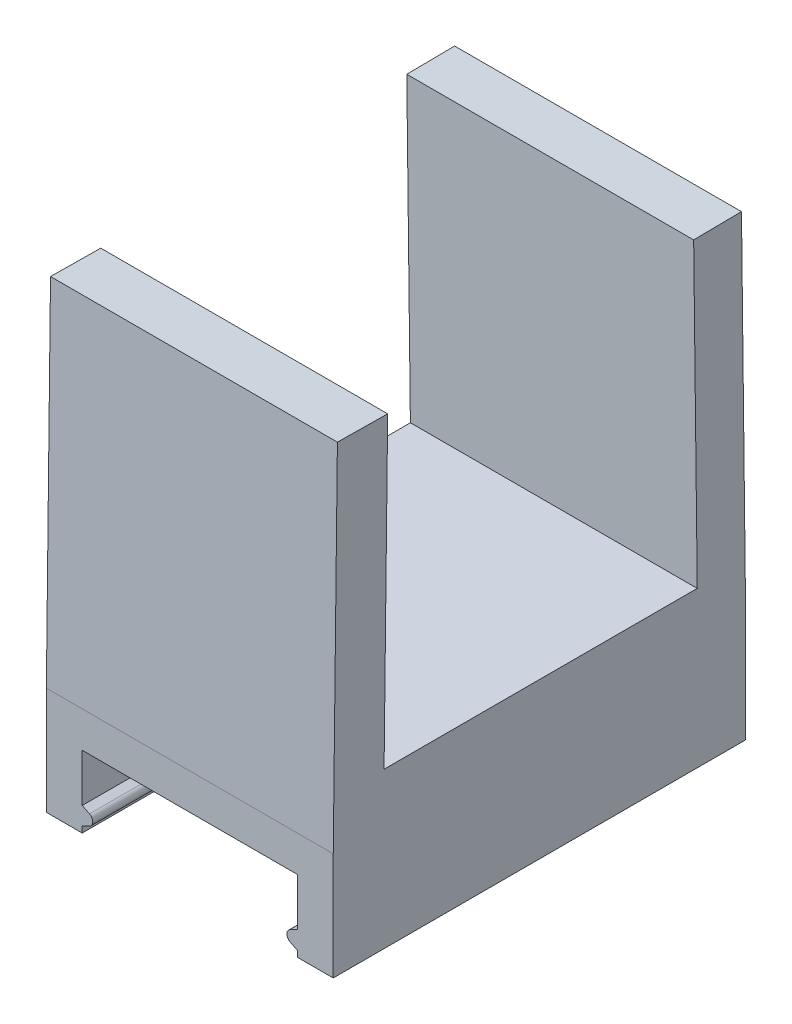
ISO-10303-21;
HEADER;
FILE_DESCRIPTION(('STEP AP214'),'2;1');
FILE_NAME('part.step','',(''),(''),'','','');
FILE_SCHEMA(('AUTOMOTIVE_DESIGN { 1 0 10303 214 1 1 1 1 }'));
ENDSEC;
DATA;
#1=APPLICATION_CONTEXT('core data for automotive mechanical design processes');
#2=APPLICATION_PROTOCOL_DEFINITION('international standard','automotive_design',2000,#1);
#3=PRODUCT_CONTEXT('',#1,'mechanical');
#4=PRODUCT('Part','Part','',(#3));
#5=PRODUCT_RELATED_PRODUCT_CATEGORY('part','',(#4));
#6=PRODUCT_DEFINITION_FORMATION('','',#4);
#7=PRODUCT_DEFINITION_CONTEXT('part definition',#1,'design');
#8=PRODUCT_DEFINITION('design','',#6,#7);
#9=PRODUCT_DEFINITION_SHAPE('','',#8);
#10=(LENGTH_UNIT() NAMED_UNIT(*) SI_UNIT(.MILLI.,.METRE.));
#11=(NAMED_UNIT(*) PLANE_ANGLE_UNIT() SI_UNIT($,.RADIAN.));
#12=(NAMED_UNIT(*) SI_UNIT($,.STERADIAN.) SOLID_ANGLE_UNIT());
#13=UNCERTAINTY_MEASURE_WITH_UNIT(LENGTH_MEASURE(1.E-05),#10,'distance_accuracy_value','');
#14=(GEOMETRIC_REPRESENTATION_CONTEXT(3) GLOBAL_UNCERTAINTY_ASSIGNED_CONTEXT((#13)) GLOBAL_UNIT_ASSIGNED_CONTEXT((#10,
#11,#12)) REPRESENTATION_CONTEXT('',''));
#15=CARTESIAN_POINT('',(0.,0.,0.));
#16=DIRECTION('',(0.,0.,1.));
#17=DIRECTION('',(1.,0.,0.));
#18=AXIS2_PLACEMENT_3D('',#15,#16,#17);
#19=CARTESIAN_POINT('',(9.,3.,34.5));
#20=DIRECTION('',(1.,0.,0.));
#21=DIRECTION('',(0.,1.,0.));
#22=AXIS2_PLACEMENT_3D('',#19,#20,#21);
#23=PLANE('',#22);
#24=DIRECTION('',(0.,-1.,0.));
#25=VECTOR('',#24,1.);
#26=CARTESIAN_POINT('',(9.,3.,0.));
#27=LINE('',#26,#25);
#28=CARTESIAN_POINT('',(9.,3.,0.));
#29=VERTEX_POINT('',#28);
#30=CARTESIAN_POINT('',(8.99999999999999,-1.,0.));
#31=VERTEX_POINT('',#30);
#32=EDGE_CURVE('E177',#29,#31,#27,.T.);
#33=ORIENTED_EDGE('',*,*,#32,.T.);
#34=DIRECTION('',(0.,0.,-1.));
#35=VECTOR('',#34,1.);
#36=CARTESIAN_POINT('',(8.99999999999999,-1.,34.5));
#37=LINE('',#36,#35);
#38=CARTESIAN_POINT('',(8.99999999999999,-1.,34.5));
#39=VERTEX_POINT('',#38);
#40=EDGE_CURVE('E11',#39,#31,#37,.T.);
#41=ORIENTED_EDGE('',*,*,#40,.F.);
#42=DIRECTION('',(0.,-1.,0.));
#43=VECTOR('',#42,1.);
#44=CARTESIAN_POINT('',(9.,3.,34.5));
#45=LINE('',#44,#43);
#46=CARTESIAN_POINT('',(9.,3.,34.5));
#47=VERTEX_POINT('',#46);
#48=EDGE_CURVE('E210',#47,#39,#45,.T.);
#49=ORIENTED_EDGE('',*,*,#48,.F.);
#50=DIRECTION('',(0.,0.,-1.));
#51=VECTOR('',#50,1.);
#52=CARTESIAN_POINT('',(9.,3.,34.5));
#53=LINE('',#52,#51);
#54=EDGE_CURVE('E173',#47,#29,#53,.T.);
#55=ORIENTED_EDGE('',*,*,#54,.T.);
#56=EDGE_LOOP('',(#33,#41,#49,#55));
#57=FACE_BOUND('',#56,.T.);
#58=ADVANCED_FACE('F33',(#57),#23,.F.);
#59=CARTESIAN_POINT('',(8.99999999999999,-1.,34.5));
#60=DIRECTION('',(0.447213595499958,-0.894427190999916,0.));
#61=DIRECTION('',(0.894427190999916,0.447213595499959,0.));
#62=AXIS2_PLACEMENT_3D('',#59,#60,#61);
#63=PLANE('',#62);
#64=DIRECTION('',(-0.894427190999916,-0.447213595499958,0.));
#65=VECTOR('',#64,1.);
#66=CARTESIAN_POINT('',(8.99999999999999,-1.,0.));
#67=LINE('',#66,#65);
#68=CARTESIAN_POINT('',(8.39442719099992,-1.30278640450004,0.));
#69=VERTEX_POINT('',#68);
#70=EDGE_CURVE('E180',#31,#69,#67,.T.);
#71=ORIENTED_EDGE('',*,*,#70,.T.);
#72=DIRECTION('',(0.,0.,-1.));
#73=VECTOR('',#72,1.);
#74=CARTESIAN_POINT('',(8.39442719099992,-1.30278640450004,34.5));
#75=LINE('',#74,#73);
#76=CARTESIAN_POINT('',(8.39442719099992,-1.30278640450004,34.5));
#77=VERTEX_POINT('',#76);
#78=EDGE_CURVE('E41',#77,#69,#75,.T.);
#79=ORIENTED_EDGE('',*,*,#78,.F.);
#80=DIRECTION('',(-0.894427190999916,-0.447213595499958,0.));
#81=VECTOR('',#80,1.);
#82=CARTESIAN_POINT('',(8.99999999999999,-1.,34.5));
#83=LINE('',#82,#81);
#84=EDGE_CURVE('E114',#39,#77,#83,.T.);
#85=ORIENTED_EDGE('',*,*,#84,.F.);
#86=ORIENTED_EDGE('',*,*,#40,.T.);
#87=EDGE_LOOP('',(#71,#79,#85,#86));
#88=FACE_BOUND('',#87,.T.);
#89=ADVANCED_FACE('F302',(#88),#63,.F.);
#90=CARTESIAN_POINT('',(8.61803398874989,-1.75,34.5));
#91=DIRECTION('',(0.,0.,-1.));
#92=DIRECTION('',(-1.,0.,0.));
#93=AXIS2_PLACEMENT_3D('',#90,#91,#92);
#94=CYLINDRICAL_SURFACE('',#93,0.499999999999999);
#95=CARTESIAN_POINT('',(8.61803398874989,-1.75,0.));
#96=DIRECTION('',(0.,0.,1.));
#97=DIRECTION('',(1.,0.,0.));
#98=AXIS2_PLACEMENT_3D('',#95,#96,#97);
#99=CIRCLE('',#98,0.499999999999999);
#100=CARTESIAN_POINT('',(8.39442719099992,-2.19721359549996,0.));
#101=VERTEX_POINT('',#100);
#102=EDGE_CURVE('E183',#69,#101,#99,.T.);
#103=ORIENTED_EDGE('',*,*,#102,.T.);
#104=DIRECTION('',(0.,0.,-1.));
#105=VECTOR('',#104,1.);
#106=CARTESIAN_POINT('',(8.39442719099992,-2.19721359549996,34.5));
#107=LINE('',#106,#105);
#108=CARTESIAN_POINT('',(8.39442719099992,-2.19721359549996,34.5));
#109=VERTEX_POINT('',#108);
#110=EDGE_CURVE('E235',#109,#101,#107,.T.);
#111=ORIENTED_EDGE('',*,*,#110,.F.);
#112=CARTESIAN_POINT('',(8.61803398874989,-1.75,34.5));
#113=DIRECTION('',(0.,0.,1.));
#114=DIRECTION('',(1.,0.,0.));
#115=AXIS2_PLACEMENT_3D('',#112,#113,#114);
#116=CIRCLE('',#115,0.499999999999999);
#117=EDGE_CURVE('E243',#77,#109,#116,.T.);
#118=ORIENTED_EDGE('',*,*,#117,.F.);
#119=ORIENTED_EDGE('',*,*,#78,.T.);
#120=EDGE_LOOP('',(#103,#111,#118,#119));
#121=FACE_BOUND('',#120,.T.);
#122=ADVANCED_FACE('F241',(#121),#94,.T.);
#123=CARTESIAN_POINT('',(9.,-2.5,34.5));
#124=DIRECTION('',(0.447213595499955,0.894427190999917,0.));
#125=DIRECTION('',(-0.894427190999917,0.447213595499955,0.));
#126=AXIS2_PLACEMENT_3D('',#123,#124,#125);
#127=PLANE('',#126);
#128=DIRECTION('',(0.894427190999917,-0.447213595499955,0.));
#129=VECTOR('',#128,1.);
#130=CARTESIAN_POINT('',(9.,-2.5,0.));
#131=LINE('',#130,#129);
#132=CARTESIAN_POINT('',(9.,-2.5,0.));
#133=VERTEX_POINT('',#132);
#134=EDGE_CURVE('E185',#101,#133,#131,.T.);
#135=ORIENTED_EDGE('',*,*,#134,.T.);
#136=DIRECTION('',(0.,0.,-1.));
#137=VECTOR('',#136,1.);
#138=CARTESIAN_POINT('',(9.,-2.5,34.5));
#139=LINE('',#138,#137);
#140=CARTESIAN_POINT('',(9.,-2.5,34.5));
#141=VERTEX_POINT('',#140);
#142=EDGE_CURVE('E232',#141,#133,#139,.T.);
#143=ORIENTED_EDGE('',*,*,#142,.F.);
#144=DIRECTION('',(0.894427190999917,-0.447213595499955,0.));
#145=VECTOR('',#144,1.);
#146=CARTESIAN_POINT('',(9.,-2.5,34.5));
#147=LINE('',#146,#145);
#148=EDGE_CURVE('E261',#109,#141,#147,.T.);
#149=ORIENTED_EDGE('',*,*,#148,.F.);
#150=ORIENTED_EDGE('',*,*,#110,.T.);
#151=EDGE_LOOP('',(#135,#143,#149,#150));
#152=FACE_BOUND('',#151,.T.);
#153=ADVANCED_FACE('F252',(#152),#127,.F.);
#154=CARTESIAN_POINT('',(9.,-2.5,34.5));
#155=DIRECTION('',(1.,0.,0.));
#156=DIRECTION('',(0.,1.,0.));
#157=AXIS2_PLACEMENT_3D('',#154,#155,#156);
#158=PLANE('',#157);
#159=DIRECTION('',(0.,-1.,0.));
#160=VECTOR('',#159,1.);
#161=CARTESIAN_POINT('',(9.,-2.5,0.));
#162=LINE('',#161,#160);
#163=CARTESIAN_POINT('',(8.99999999999999,-3.,0.));
#164=VERTEX_POINT('',#163);
#165=EDGE_CURVE('E187',#133,#164,#162,.T.);
#166=ORIENTED_EDGE('',*,*,#165,.T.);
#167=DIRECTION('',(0.,0.,-1.));
#168=VECTOR('',#167,1.);
#169=CARTESIAN_POINT('',(8.99999999999999,-3.,34.5));
#170=LINE('',#169,#168);
#171=CARTESIAN_POINT('',(8.99999999999999,-3.,34.5));
#172=VERTEX_POINT('',#171);
#173=EDGE_CURVE('E229',#172,#164,#170,.T.);
#174=ORIENTED_EDGE('',*,*,#173,.F.);
#175=DIRECTION('',(0.,-1.,0.));
#176=VECTOR('',#175,1.);
#177=CARTESIAN_POINT('',(9.,-2.5,34.5));
#178=LINE('',#177,#176);
#179=EDGE_CURVE('E258',#141,#172,#178,.T.);
#180=ORIENTED_EDGE('',*,*,#179,.F.);
#181=ORIENTED_EDGE('',*,*,#142,.T.);
#182=EDGE_LOOP('',(#166,#174,#180,#181));
#183=FACE_BOUND('',#182,.T.);
#184=ADVANCED_FACE('F256',(#183),#158,.F.);
#185=CARTESIAN_POINT('',(12.,-3.,34.5));
#186=DIRECTION('',(0.,1.,0.));
#187=DIRECTION('',(-1.,0.,0.));
#188=AXIS2_PLACEMENT_3D('',#185,#186,#187);
#189=PLANE('',#188);
#190=DIRECTION('',(1.,0.,0.));
#191=VECTOR('',#190,1.);
#192=CARTESIAN_POINT('',(12.,-3.,0.));
#193=LINE('',#192,#191);
#194=CARTESIAN_POINT('',(12.,-3.,0.));
#195=VERTEX_POINT('',#194);
#196=EDGE_CURVE('E189',#164,#195,#193,.T.);
#197=ORIENTED_EDGE('',*,*,#196,.T.);
#198=DIRECTION('',(0.,0.,-1.));
#199=VECTOR('',#198,1.);
#200=CARTESIAN_POINT('',(12.,-3.,34.5));
#201=LINE('',#200,#199);
#202=CARTESIAN_POINT('',(12.,-3.,34.5));
#203=VERTEX_POINT('',#202);
#204=EDGE_CURVE('E226',#203,#195,#201,.T.);
#205=ORIENTED_EDGE('',*,*,#204,.F.);
#206=DIRECTION('',(1.,0.,0.));
#207=VECTOR('',#206,1.);
#208=CARTESIAN_POINT('',(12.,-3.,34.5));
#209=LINE('',#208,#207);
#210=EDGE_CURVE('E260',#172,#203,#209,.T.);
#211=ORIENTED_EDGE('',*,*,#210,.F.);
#212=ORIENTED_EDGE('',*,*,#173,.T.);
#213=EDGE_LOOP('',(#197,#205,#211,#212));
#214=FACE_BOUND('',#213,.T.);
#215=ADVANCED_FACE('F315',(#214),#189,.F.);
#216=CARTESIAN_POINT('',(12.,6.,34.5));
#217=DIRECTION('',(-1.,0.,0.));
#218=DIRECTION('',(0.,0.,1.));
#219=AXIS2_PLACEMENT_3D('',#216,#217,#218);
#220=PLANE('',#219);
#221=DIRECTION('',(0.,1.,0.));
#222=VECTOR('',#221,1.);
#223=CARTESIAN_POINT('',(12.,6.,0.));
#224=LINE('',#223,#222);
#225=CARTESIAN_POINT('',(12.,6.,0.));
#226=VERTEX_POINT('',#225);
#227=EDGE_CURVE('E191',#195,#226,#224,.T.);
#228=ORIENTED_EDGE('',*,*,#227,.T.);
#229=DIRECTION('',(0.,0.999930257157274,0.0118101998876774));
#230=VECTOR('',#229,1.);
#231=CARTESIAN_POINT('',(12.,6.,0.));
#232=LINE('',#231,#230);
#233=CARTESIAN_POINT('',(12.,35.4472407995507,0.347802056687385));
#234=VERTEX_POINT('',#233);
#235=EDGE_CURVE('E516',#226,#234,#232,.T.);
#236=ORIENTED_EDGE('',*,*,#235,.T.);
#237=DIRECTION('',(0.,-0.0118101998876786,0.999930257157275));
#238=VECTOR('',#237,1.);
#239=CARTESIAN_POINT('',(12.,35.4,4.34752308531648));
#240=LINE('',#239,#238);
#241=CARTESIAN_POINT('',(12.,35.4,4.34752308531648));
#242=VERTEX_POINT('',#241);
#243=EDGE_CURVE('E519',#234,#242,#240,.T.);
#244=ORIENTED_EDGE('',*,*,#243,.T.);
#245=DIRECTION('',(0.,-0.999930257157274,-0.0118101998876776));
#246=VECTOR('',#245,1.);
#247=CARTESIAN_POINT('',(12.,10.,4.04752308531665));
#248=LINE('',#247,#246);
#249=CARTESIAN_POINT('',(12.,10.,4.04752308531665));
#250=VERTEX_POINT('',#249);
#251=EDGE_CURVE('E522',#242,#250,#248,.T.);
#252=ORIENTED_EDGE('',*,*,#251,.T.);
#253=DIRECTION('',(0.,0.,1.));
#254=VECTOR('',#253,1.);
#255=CARTESIAN_POINT('',(12.,10.,30.2475230853167));
#256=LINE('',#255,#254);
#257=CARTESIAN_POINT('',(12.,10.,30.2475230853167));
#258=VERTEX_POINT('',#257);
#259=EDGE_CURVE('E493',#250,#258,#256,.T.);
#260=ORIENTED_EDGE('',*,*,#259,.T.);
#261=DIRECTION('',(0.,0.99993134252064,-0.0117179454201705));
#262=VECTOR('',#261,1.);
#263=CARTESIAN_POINT('',(12.,35.6,29.9475230853165));
#264=LINE('',#263,#262);
#265=CARTESIAN_POINT('',(12.,35.6,29.9475230853165));
#266=VERTEX_POINT('',#265);
#267=EDGE_CURVE('E181',#258,#266,#264,.T.);
#268=ORIENTED_EDGE('',*,*,#267,.T.);
#269=DIRECTION('',(0.,0.0117179454201706,0.99993134252064));
#270=VECTOR('',#269,1.);
#271=CARTESIAN_POINT('',(12.,35.6492776301851,34.1525475277711));
#272=LINE('',#271,#270);
#273=CARTESIAN_POINT('',(12.,35.6492776301851,34.1525475277711));
#274=VERTEX_POINT('',#273);
#275=EDGE_CURVE('E471',#266,#274,#272,.T.);
#276=ORIENTED_EDGE('',*,*,#275,.T.);
#277=DIRECTION('',(0.,-0.99993134252064,0.0117179454201708));
#278=VECTOR('',#277,1.);
#279=CARTESIAN_POINT('',(12.,35.6492776301851,34.1525475277711));
#280=LINE('',#279,#278);
#281=CARTESIAN_POINT('',(12.,6.,34.5));
#282=VERTEX_POINT('',#281);
#283=EDGE_CURVE('E473',#274,#282,#280,.T.);
#284=ORIENTED_EDGE('',*,*,#283,.T.);
#285=DIRECTION('',(0.,1.,0.));
#286=VECTOR('',#285,1.);
#287=CARTESIAN_POINT('',(12.,6.,34.5));
#288=LINE('',#287,#286);
#289=EDGE_CURVE('E263',#203,#282,#288,.T.);
#290=ORIENTED_EDGE('',*,*,#289,.F.);
#291=ORIENTED_EDGE('',*,*,#204,.T.);
#292=EDGE_LOOP('',(#228,#236,#244,#252,#260,#268,#276,#284,#290,#291));
#293=FACE_BOUND('',#292,.T.);
#294=ADVANCED_FACE('F318',(#293),#220,.F.);
#295=CARTESIAN_POINT('',(-12.,-3.,34.5));
#296=DIRECTION('',(1.,0.,0.));
#297=DIRECTION('',(0.,0.,-1.));
#298=AXIS2_PLACEMENT_3D('',#295,#296,#297);
#299=PLANE('',#298);
#300=DIRECTION('',(0.,-1.,0.));
#301=VECTOR('',#300,1.);
#302=CARTESIAN_POINT('',(-12.,-3.,0.));
#303=LINE('',#302,#301);
#304=CARTESIAN_POINT('',(-12.,6.,0.));
#305=VERTEX_POINT('',#304);
#306=CARTESIAN_POINT('',(-12.,-3.,0.));
#307=VERTEX_POINT('',#306);
#308=EDGE_CURVE('E197',#305,#307,#303,.T.);
#309=ORIENTED_EDGE('',*,*,#308,.T.);
#310=DIRECTION('',(0.,0.,-1.));
#311=VECTOR('',#310,1.);
#312=CARTESIAN_POINT('',(-12.,-3.,34.5));
#313=LINE('',#312,#311);
#314=CARTESIAN_POINT('',(-12.,-3.,34.5));
#315=VERTEX_POINT('',#314);
#316=EDGE_CURVE('E223',#315,#307,#313,.T.);
#317=ORIENTED_EDGE('',*,*,#316,.F.);
#318=DIRECTION('',(0.,-1.,0.));
#319=VECTOR('',#318,1.);
#320=CARTESIAN_POINT('',(-12.,-3.,34.5));
#321=LINE('',#320,#319);
#322=CARTESIAN_POINT('',(-12.,6.,34.5));
#323=VERTEX_POINT('',#322);
#324=EDGE_CURVE('E271',#323,#315,#321,.T.);
#325=ORIENTED_EDGE('',*,*,#324,.F.);
#326=DIRECTION('',(0.,0.99993134252064,-0.0117179454201708));
#327=VECTOR('',#326,1.);
#328=CARTESIAN_POINT('',(-12.,35.6492776301851,34.1525475277711));
#329=LINE('',#328,#327);
#330=CARTESIAN_POINT('',(-12.,35.6492776301851,34.1525475277711));
#331=VERTEX_POINT('',#330);
#332=EDGE_CURVE('E479',#323,#331,#329,.T.);
#333=ORIENTED_EDGE('',*,*,#332,.T.);
#334=DIRECTION('',(0.,-0.0117179454201706,-0.99993134252064));
#335=VECTOR('',#334,1.);
#336=CARTESIAN_POINT('',(-12.,35.6492776301851,34.1525475277711));
#337=LINE('',#336,#335);
#338=CARTESIAN_POINT('',(-12.,35.6,29.9475230853165));
#339=VERTEX_POINT('',#338);
#340=EDGE_CURVE('E511',#331,#339,#337,.T.);
#341=ORIENTED_EDGE('',*,*,#340,.T.);
#342=DIRECTION('',(0.,-0.99993134252064,0.0117179454201705));
#343=VECTOR('',#342,1.);
#344=CARTESIAN_POINT('',(-12.,35.6,29.9475230853165));
#345=LINE('',#344,#343);
#346=CARTESIAN_POINT('',(-12.,10.,30.2475230853167));
#347=VERTEX_POINT('',#346);
#348=EDGE_CURVE('E508',#339,#347,#345,.T.);
#349=ORIENTED_EDGE('',*,*,#348,.T.);
#350=DIRECTION('',(0.,0.,-1.));
#351=VECTOR('',#350,1.);
#352=CARTESIAN_POINT('',(-12.,10.,30.2475230853167));
#353=LINE('',#352,#351);
#354=CARTESIAN_POINT('',(-12.,10.,4.04752308531665));
#355=VERTEX_POINT('',#354);
#356=EDGE_CURVE('E505',#347,#355,#353,.T.);
#357=ORIENTED_EDGE('',*,*,#356,.T.);
#358=DIRECTION('',(0.,0.999930257157275,0.0118101998876776));
#359=VECTOR('',#358,1.);
#360=CARTESIAN_POINT('',(-12.,10.,4.04752308531665));
#361=LINE('',#360,#359);
#362=CARTESIAN_POINT('',(-12.,35.4,4.34752308531648));
#363=VERTEX_POINT('',#362);
#364=EDGE_CURVE('E502',#355,#363,#361,.T.);
#365=ORIENTED_EDGE('',*,*,#364,.T.);
#366=DIRECTION('',(0.,0.0118101998876786,-0.999930257157274));
#367=VECTOR('',#366,1.);
#368=CARTESIAN_POINT('',(-12.,35.4,4.34752308531648));
#369=LINE('',#368,#367);
#370=CARTESIAN_POINT('',(-12.,35.4472407995507,0.347802056687385));
#371=VERTEX_POINT('',#370);
#372=EDGE_CURVE('E499',#363,#371,#369,.T.);
#373=ORIENTED_EDGE('',*,*,#372,.T.);
#374=DIRECTION('',(0.,-0.999930257157274,-0.0118101998876774));
#375=VECTOR('',#374,1.);
#376=CARTESIAN_POINT('',(-12.,6.,0.));
#377=LINE('',#376,#375);
#378=EDGE_CURVE('E496',#371,#305,#377,.T.);
#379=ORIENTED_EDGE('',*,*,#378,.T.);
#380=EDGE_LOOP('',(#309,#317,#325,#333,#341,#349,#357,#365,#373,#379));
#381=FACE_BOUND('',#380,.T.);
#382=ADVANCED_FACE('F322',(#381),#299,.F.);
#383=CARTESIAN_POINT('',(-9.,-3.,34.5));
#384=DIRECTION('',(0.,1.,0.));
#385=DIRECTION('',(0.,0.,1.));
#386=AXIS2_PLACEMENT_3D('',#383,#384,#385);
#387=PLANE('',#386);
#388=DIRECTION('',(1.,0.,0.));
#389=VECTOR('',#388,1.);
#390=CARTESIAN_POINT('',(-9.,-3.,0.));
#391=LINE('',#390,#389);
#392=CARTESIAN_POINT('',(-9.,-3.,0.));
#393=VERTEX_POINT('',#392);
#394=EDGE_CURVE('E199',#307,#393,#391,.T.);
#395=ORIENTED_EDGE('',*,*,#394,.T.);
#396=DIRECTION('',(0.,0.,-1.));
#397=VECTOR('',#396,1.);
#398=CARTESIAN_POINT('',(-9.,-3.,34.5));
#399=LINE('',#398,#397);
#400=CARTESIAN_POINT('',(-9.,-3.,34.5));
#401=VERTEX_POINT('',#400);
#402=EDGE_CURVE('E220',#401,#393,#399,.T.);
#403=ORIENTED_EDGE('',*,*,#402,.F.);
#404=DIRECTION('',(1.,0.,0.));
#405=VECTOR('',#404,1.);
#406=CARTESIAN_POINT('',(-9.,-3.,34.5));
#407=LINE('',#406,#405);
#408=EDGE_CURVE('E273',#315,#401,#407,.T.);
#409=ORIENTED_EDGE('',*,*,#408,.F.);
#410=ORIENTED_EDGE('',*,*,#316,.T.);
#411=EDGE_LOOP('',(#395,#403,#409,#410));
#412=FACE_BOUND('',#411,.T.);
#413=ADVANCED_FACE('F326',(#412),#387,.F.);
#414=CARTESIAN_POINT('',(-9.,-2.5,34.5));
#415=DIRECTION('',(-1.,0.,0.));
#416=DIRECTION('',(0.,0.,1.));
#417=AXIS2_PLACEMENT_3D('',#414,#415,#416);
#418=PLANE('',#417);
#419=DIRECTION('',(0.,1.,0.));
#420=VECTOR('',#419,1.);
#421=CARTESIAN_POINT('',(-9.,-2.5,0.));
#422=LINE('',#421,#420);
#423=CARTESIAN_POINT('',(-9.,-2.5,0.));
#424=VERTEX_POINT('',#423);
#425=EDGE_CURVE('E201',#393,#424,#422,.T.);
#426=ORIENTED_EDGE('',*,*,#425,.T.);
#427=DIRECTION('',(0.,0.,-1.));
#428=VECTOR('',#427,1.);
#429=CARTESIAN_POINT('',(-9.,-2.5,34.5));
#430=LINE('',#429,#428);
#431=CARTESIAN_POINT('',(-9.,-2.5,34.5));
#432=VERTEX_POINT('',#431);
#433=EDGE_CURVE('E217',#432,#424,#430,.T.);
#434=ORIENTED_EDGE('',*,*,#433,.F.);
#435=DIRECTION('',(0.,1.,0.));
#436=VECTOR('',#435,1.);
#437=CARTESIAN_POINT('',(-9.,-2.5,34.5));
#438=LINE('',#437,#436);
#439=EDGE_CURVE('E275',#401,#432,#438,.T.);
#440=ORIENTED_EDGE('',*,*,#439,.F.);
#441=ORIENTED_EDGE('',*,*,#402,.T.);
#442=EDGE_LOOP('',(#426,#434,#440,#441));
#443=FACE_BOUND('',#442,.T.);
#444=ADVANCED_FACE('F330',(#443),#418,.F.);
#445=CARTESIAN_POINT('',(-9.,-2.5,34.5));
#446=DIRECTION('',(-0.447213595499958,0.894427190999916,0.));
#447=DIRECTION('',(-0.894427190999916,-0.447213595499959,0.));
#448=AXIS2_PLACEMENT_3D('',#445,#446,#447);
#449=PLANE('',#448);
#450=DIRECTION('',(0.894427190999916,0.447213595499958,0.));
#451=VECTOR('',#450,1.);
#452=CARTESIAN_POINT('',(-9.,-2.5,0.));
#453=LINE('',#452,#451);
#454=CARTESIAN_POINT('',(-8.39442719099992,-2.19721359549996,0.));
#455=VERTEX_POINT('',#454);
#456=EDGE_CURVE('E203',#424,#455,#453,.T.);
#457=ORIENTED_EDGE('',*,*,#456,.T.);
#458=DIRECTION('',(0.,0.,-1.));
#459=VECTOR('',#458,1.);
#460=CARTESIAN_POINT('',(-8.39442719099992,-2.19721359549996,34.5));
#461=LINE('',#460,#459);
#462=CARTESIAN_POINT('',(-8.39442719099992,-2.19721359549996,34.5));
#463=VERTEX_POINT('',#462);
#464=EDGE_CURVE('E214',#463,#455,#461,.T.);
#465=ORIENTED_EDGE('',*,*,#464,.F.);
#466=DIRECTION('',(0.894427190999916,0.447213595499958,0.));
#467=VECTOR('',#466,1.);
#468=CARTESIAN_POINT('',(-9.,-2.5,34.5));
#469=LINE('',#468,#467);
#470=EDGE_CURVE('E277',#432,#463,#469,.T.);
#471=ORIENTED_EDGE('',*,*,#470,.F.);
#472=ORIENTED_EDGE('',*,*,#433,.T.);
#473=EDGE_LOOP('',(#457,#465,#471,#472));
#474=FACE_BOUND('',#473,.T.);
#475=ADVANCED_FACE('F283',(#474),#449,.F.);
#476=CARTESIAN_POINT('',(-8.61803398874989,-1.75,34.5));
#477=DIRECTION('',(0.,0.,-1.));
#478=DIRECTION('',(-1.,0.,0.));
#479=AXIS2_PLACEMENT_3D('',#476,#477,#478);
#480=CYLINDRICAL_SURFACE('',#479,0.499999999999999);
#481=CARTESIAN_POINT('',(-8.61803398874989,-1.75,0.));
#482=DIRECTION('',(0.,0.,1.));
#483=DIRECTION('',(-1.,0.,0.));
#484=AXIS2_PLACEMENT_3D('',#481,#482,#483);
#485=CIRCLE('',#484,0.499999999999999);
#486=CARTESIAN_POINT('',(-8.39442719099992,-1.30278640450004,0.));
#487=VERTEX_POINT('',#486);
#488=EDGE_CURVE('E205',#455,#487,#485,.T.);
#489=ORIENTED_EDGE('',*,*,#488,.T.);
#490=DIRECTION('',(0.,0.,-1.));
#491=VECTOR('',#490,1.);
#492=CARTESIAN_POINT('',(-8.39442719099992,-1.30278640450004,34.5));
#493=LINE('',#492,#491);
#494=CARTESIAN_POINT('',(-8.39442719099992,-1.30278640450004,34.5));
#495=VERTEX_POINT('',#494);
#496=EDGE_CURVE('E168',#495,#487,#493,.T.);
#497=ORIENTED_EDGE('',*,*,#496,.F.);
#498=CARTESIAN_POINT('',(-8.61803398874989,-1.75,34.5));
#499=DIRECTION('',(0.,0.,1.));
#500=DIRECTION('',(-1.,0.,0.));
#501=AXIS2_PLACEMENT_3D('',#498,#499,#500);
#502=CIRCLE('',#501,0.499999999999999);
#503=EDGE_CURVE('E159',#463,#495,#502,.T.);
#504=ORIENTED_EDGE('',*,*,#503,.F.);
#505=ORIENTED_EDGE('',*,*,#464,.T.);
#506=EDGE_LOOP('',(#489,#497,#504,#505));
#507=FACE_BOUND('',#506,.T.);
#508=ADVANCED_FACE('F287',(#507),#480,.T.);
#509=CARTESIAN_POINT('',(-9.,-1.,34.5));
#510=DIRECTION('',(-0.447213595499958,-0.894427190999916,0.));
#511=DIRECTION('',(0.894427190999916,-0.447213595499959,0.));
#512=AXIS2_PLACEMENT_3D('',#509,#510,#511);
#513=PLANE('',#512);
#514=DIRECTION('',(-0.894427190999916,0.447213595499958,0.));
#515=VECTOR('',#514,1.);
#516=CARTESIAN_POINT('',(-9.,-1.,0.));
#517=LINE('',#516,#515);
#518=CARTESIAN_POINT('',(-9.,-1.,0.));
#519=VERTEX_POINT('',#518);
#520=EDGE_CURVE('E167',#487,#519,#517,.T.);
#521=ORIENTED_EDGE('',*,*,#520,.T.);
#522=DIRECTION('',(0.,0.,-1.));
#523=VECTOR('',#522,1.);
#524=CARTESIAN_POINT('',(-9.,-1.,34.5));
#525=LINE('',#524,#523);
#526=CARTESIAN_POINT('',(-9.,-1.,34.5));
#527=VERTEX_POINT('',#526);
#528=EDGE_CURVE('E164',#527,#519,#525,.T.);
#529=ORIENTED_EDGE('',*,*,#528,.F.);
#530=DIRECTION('',(-0.894427190999916,0.447213595499958,0.));
#531=VECTOR('',#530,1.);
#532=CARTESIAN_POINT('',(-9.,-1.,34.5));
#533=LINE('',#532,#531);
#534=EDGE_CURVE('E153',#495,#527,#533,.T.);
#535=ORIENTED_EDGE('',*,*,#534,.F.);
#536=ORIENTED_EDGE('',*,*,#496,.T.);
#537=EDGE_LOOP('',(#521,#529,#535,#536));
#538=FACE_BOUND('',#537,.T.);
#539=ADVANCED_FACE('F165',(#538),#513,.F.);
#540=CARTESIAN_POINT('',(-9.,3.,34.5));
#541=DIRECTION('',(-1.,0.,0.));
#542=DIRECTION('',(0.,-1.,0.));
#543=AXIS2_PLACEMENT_3D('',#540,#541,#542);
#544=PLANE('',#543);
#545=DIRECTION('',(0.,1.,0.));
#546=VECTOR('',#545,1.);
#547=CARTESIAN_POINT('',(-9.,3.,0.));
#548=LINE('',#547,#546);
#549=CARTESIAN_POINT('',(-9.,3.,0.));
#550=VERTEX_POINT('',#549);
#551=EDGE_CURVE('E100',#519,#550,#548,.T.);
#552=ORIENTED_EDGE('',*,*,#551,.T.);
#553=DIRECTION('',(0.,0.,-1.));
#554=VECTOR('',#553,1.);
#555=CARTESIAN_POINT('',(-9.,3.,34.5));
#556=LINE('',#555,#554);
#557=CARTESIAN_POINT('',(-9.,3.,34.5));
#558=VERTEX_POINT('',#557);
#559=EDGE_CURVE('E169',#558,#550,#556,.T.);
#560=ORIENTED_EDGE('',*,*,#559,.F.);
#561=DIRECTION('',(0.,1.,0.));
#562=VECTOR('',#561,1.);
#563=CARTESIAN_POINT('',(-9.,3.,34.5));
#564=LINE('',#563,#562);
#565=EDGE_CURVE('E157',#527,#558,#564,.T.);
#566=ORIENTED_EDGE('',*,*,#565,.F.);
#567=ORIENTED_EDGE('',*,*,#528,.T.);
#568=EDGE_LOOP('',(#552,#560,#566,#567));
#569=FACE_BOUND('',#568,.T.);
#570=ADVANCED_FACE('F171',(#569),#544,.F.);
#571=CARTESIAN_POINT('',(-9.,3.,34.5));
#572=DIRECTION('',(0.,1.,0.));
#573=DIRECTION('',(0.,0.,1.));
#574=AXIS2_PLACEMENT_3D('',#571,#572,#573);
#575=PLANE('',#574);
#576=DIRECTION('',(1.,0.,0.));
#577=VECTOR('',#576,1.);
#578=CARTESIAN_POINT('',(-9.,3.,0.));
#579=LINE('',#578,#577);
#580=EDGE_CURVE('E106',#550,#29,#579,.T.);
#581=ORIENTED_EDGE('',*,*,#580,.T.);
#582=ORIENTED_EDGE('',*,*,#54,.F.);
#583=DIRECTION('',(1.,0.,0.));
#584=VECTOR('',#583,1.);
#585=CARTESIAN_POINT('',(-9.,3.,34.5));
#586=LINE('',#585,#584);
#587=EDGE_CURVE('E49',#558,#47,#586,.T.);
#588=ORIENTED_EDGE('',*,*,#587,.F.);
#589=ORIENTED_EDGE('',*,*,#559,.T.);
#590=EDGE_LOOP('',(#581,#582,#588,#589));
#591=FACE_BOUND('',#590,.T.);
#592=ADVANCED_FACE('F291',(#591),#575,.F.);
#593=CARTESIAN_POINT('',(8.61803398874989,-1.75,34.5));
#594=DIRECTION('',(0.,0.,1.));
#595=DIRECTION('',(1.,0.,0.));
#596=AXIS2_PLACEMENT_3D('',#593,#594,#595);
#597=PLANE('',#596);
#598=ORIENTED_EDGE('',*,*,#48,.T.);
#599=ORIENTED_EDGE('',*,*,#84,.T.);
#600=ORIENTED_EDGE('',*,*,#117,.T.);
#601=ORIENTED_EDGE('',*,*,#148,.T.);
#602=ORIENTED_EDGE('',*,*,#179,.T.);
#603=ORIENTED_EDGE('',*,*,#210,.T.);
#604=ORIENTED_EDGE('',*,*,#289,.T.);
#605=DIRECTION('',(-1.,0.,0.));
#606=VECTOR('',#605,1.);
#607=CARTESIAN_POINT('',(-12.,6.,34.5));
#608=LINE('',#607,#606);
#609=EDGE_CURVE('E269',#282,#323,#608,.T.);
#610=ORIENTED_EDGE('',*,*,#609,.T.);
#611=ORIENTED_EDGE('',*,*,#324,.T.);
#612=ORIENTED_EDGE('',*,*,#408,.T.);
#613=ORIENTED_EDGE('',*,*,#439,.T.);
#614=ORIENTED_EDGE('',*,*,#470,.T.);
#615=ORIENTED_EDGE('',*,*,#503,.T.);
#616=ORIENTED_EDGE('',*,*,#534,.T.);
#617=ORIENTED_EDGE('',*,*,#565,.T.);
#618=ORIENTED_EDGE('',*,*,#587,.T.);
#619=EDGE_LOOP('',(#598,#599,#600,#601,#602,#603,#604,#610,#611,#612,#613,#614,#615,#616,#617,#618));
#620=FACE_BOUND('',#619,.T.);
#621=ADVANCED_FACE('F155',(#620),#597,.T.);
#622=CARTESIAN_POINT('',(8.61803398874989,-1.75,0.));
#623=DIRECTION('',(0.,0.,1.));
#624=DIRECTION('',(1.,0.,0.));
#625=AXIS2_PLACEMENT_3D('',#622,#623,#624);
#626=PLANE('',#625);
#627=ORIENTED_EDGE('',*,*,#32,.F.);
#628=ORIENTED_EDGE('',*,*,#580,.F.);
#629=ORIENTED_EDGE('',*,*,#551,.F.);
#630=ORIENTED_EDGE('',*,*,#520,.F.);
#631=ORIENTED_EDGE('',*,*,#488,.F.);
#632=ORIENTED_EDGE('',*,*,#456,.F.);
#633=ORIENTED_EDGE('',*,*,#425,.F.);
#634=ORIENTED_EDGE('',*,*,#394,.F.);
#635=ORIENTED_EDGE('',*,*,#308,.F.);
#636=DIRECTION('',(-1.,0.,0.));
#637=VECTOR('',#636,1.);
#638=CARTESIAN_POINT('',(-12.,6.,0.));
#639=LINE('',#638,#637);
#640=EDGE_CURVE('E194',#226,#305,#639,.T.);
#641=ORIENTED_EDGE('',*,*,#640,.F.);
#642=ORIENTED_EDGE('',*,*,#227,.F.);
#643=ORIENTED_EDGE('',*,*,#196,.F.);
#644=ORIENTED_EDGE('',*,*,#165,.F.);
#645=ORIENTED_EDGE('',*,*,#134,.F.);
#646=ORIENTED_EDGE('',*,*,#102,.F.);
#647=ORIENTED_EDGE('',*,*,#70,.F.);
#648=EDGE_LOOP('',(#627,#628,#629,#630,#631,#632,#633,#634,#635,#641,#642,#643,#644,#645,#646,#647));
#649=FACE_BOUND('',#648,.T.);
#650=ADVANCED_FACE('F247',(#649),#626,.F.);
#651=CARTESIAN_POINT('',(57.4898852932363,35.6492776301851,34.1525475277711));
#652=DIRECTION('',(0.,0.99993134252064,-0.0117179454201706));
#653=DIRECTION('',(0.,0.0117179454201706,0.99993134252064));
#654=AXIS2_PLACEMENT_3D('',#651,#652,#653);
#655=PLANE('',#654);
#656=ORIENTED_EDGE('',*,*,#275,.F.);
#657=DIRECTION('',(-1.,0.,0.));
#658=VECTOR('',#657,1.);
#659=CARTESIAN_POINT('',(57.4898852932363,35.6,29.9475230853165));
#660=LINE('',#659,#658);
#661=EDGE_CURVE('E465',#266,#339,#660,.T.);
#662=ORIENTED_EDGE('',*,*,#661,.T.);
#663=ORIENTED_EDGE('',*,*,#340,.F.);
#664=DIRECTION('',(-1.,0.,0.));
#665=VECTOR('',#664,1.);
#666=CARTESIAN_POINT('',(57.4898852932363,35.6492776301851,34.1525475277711));
#667=LINE('',#666,#665);
#668=EDGE_CURVE('E490',#274,#331,#667,.T.);
#669=ORIENTED_EDGE('',*,*,#668,.F.);
#670=EDGE_LOOP('',(#656,#662,#663,#669));
#671=FACE_BOUND('',#670,.T.);
#672=ADVANCED_FACE('F382',(#671),#655,.T.);
#673=CARTESIAN_POINT('',(57.4898852932363,35.6492776301851,34.1525475277711));
#674=DIRECTION('',(0.,0.0117179454201708,0.99993134252064));
#675=DIRECTION('',(0.,-0.99993134252064,0.0117179454201708));
#676=AXIS2_PLACEMENT_3D('',#673,#674,#675);
#677=PLANE('',#676);
#678=ORIENTED_EDGE('',*,*,#283,.F.);
#679=ORIENTED_EDGE('',*,*,#668,.T.);
#680=ORIENTED_EDGE('',*,*,#332,.F.);
#681=ORIENTED_EDGE('',*,*,#609,.F.);
#682=EDGE_LOOP('',(#678,#679,#680,#681));
#683=FACE_BOUND('',#682,.T.);
#684=ADVANCED_FACE('F389',(#683),#677,.T.);
#685=CARTESIAN_POINT('',(57.4898852932363,6.,0.));
#686=DIRECTION('',(0.,0.0118101998876774,-0.999930257157274));
#687=DIRECTION('',(0.,0.999930257157274,0.0118101998876774));
#688=AXIS2_PLACEMENT_3D('',#685,#686,#687);
#689=PLANE('',#688);
#690=ORIENTED_EDGE('',*,*,#235,.F.);
#691=ORIENTED_EDGE('',*,*,#640,.T.);
#692=ORIENTED_EDGE('',*,*,#378,.F.);
#693=DIRECTION('',(-1.,0.,0.));
#694=VECTOR('',#693,1.);
#695=CARTESIAN_POINT('',(57.4898852932363,35.4472407995507,0.347802056687385));
#696=LINE('',#695,#694);
#697=EDGE_CURVE('E487',#234,#371,#696,.T.);
#698=ORIENTED_EDGE('',*,*,#697,.F.);
#699=EDGE_LOOP('',(#690,#691,#692,#698));
#700=FACE_BOUND('',#699,.T.);
#701=ADVANCED_FACE('F399',(#700),#689,.T.);
#702=CARTESIAN_POINT('',(57.4898852932363,35.4,4.34752308531648));
#703=DIRECTION('',(0.,0.999930257157275,0.0118101998876786));
#704=DIRECTION('',(0.,-0.0118101998876786,0.999930257157275));
#705=AXIS2_PLACEMENT_3D('',#702,#703,#704);
#706=PLANE('',#705);
#707=ORIENTED_EDGE('',*,*,#243,.F.);
#708=ORIENTED_EDGE('',*,*,#697,.T.);
#709=ORIENTED_EDGE('',*,*,#372,.F.);
#710=DIRECTION('',(-1.,0.,0.));
#711=VECTOR('',#710,1.);
#712=CARTESIAN_POINT('',(57.4898852932363,35.4,4.34752308531648));
#713=LINE('',#712,#711);
#714=EDGE_CURVE('E484',#242,#363,#713,.T.);
#715=ORIENTED_EDGE('',*,*,#714,.F.);
#716=EDGE_LOOP('',(#707,#708,#709,#715));
#717=FACE_BOUND('',#716,.T.);
#718=ADVANCED_FACE('F409',(#717),#706,.T.);
#719=CARTESIAN_POINT('',(57.4898852932363,10.,4.04752308531665));
#720=DIRECTION('',(0.,-0.0118101998876776,0.999930257157274));
#721=DIRECTION('',(0.,-0.999930257157274,-0.0118101998876776));
#722=AXIS2_PLACEMENT_3D('',#719,#720,#721);
#723=PLANE('',#722);
#724=ORIENTED_EDGE('',*,*,#251,.F.);
#725=ORIENTED_EDGE('',*,*,#714,.T.);
#726=ORIENTED_EDGE('',*,*,#364,.F.);
#727=DIRECTION('',(-1.,0.,0.));
#728=VECTOR('',#727,1.);
#729=CARTESIAN_POINT('',(57.4898852932363,10.,4.04752308531665));
#730=LINE('',#729,#728);
#731=EDGE_CURVE('E481',#250,#355,#730,.T.);
#732=ORIENTED_EDGE('',*,*,#731,.F.);
#733=EDGE_LOOP('',(#724,#725,#726,#732));
#734=FACE_BOUND('',#733,.T.);
#735=ADVANCED_FACE('F419',(#734),#723,.T.);
#736=CARTESIAN_POINT('',(57.4898852932363,10.,30.2475230853167));
#737=DIRECTION('',(0.,1.,0.));
#738=DIRECTION('',(0.,0.,1.));
#739=AXIS2_PLACEMENT_3D('',#736,#737,#738);
#740=PLANE('',#739);
#741=ORIENTED_EDGE('',*,*,#259,.F.);
#742=ORIENTED_EDGE('',*,*,#731,.T.);
#743=ORIENTED_EDGE('',*,*,#356,.F.);
#744=DIRECTION('',(-1.,0.,0.));
#745=VECTOR('',#744,1.);
#746=CARTESIAN_POINT('',(57.4898852932363,10.,30.2475230853167));
#747=LINE('',#746,#745);
#748=EDGE_CURVE('E461',#258,#347,#747,.T.);
#749=ORIENTED_EDGE('',*,*,#748,.F.);
#750=EDGE_LOOP('',(#741,#742,#743,#749));
#751=FACE_BOUND('',#750,.T.);
#752=ADVANCED_FACE('F429',(#751),#740,.T.);
#753=CARTESIAN_POINT('',(57.4898852932363,35.6,29.9475230853165));
#754=DIRECTION('',(0.,-0.0117179454201705,-0.99993134252064));
#755=DIRECTION('',(0.,0.99993134252064,-0.0117179454201705));
#756=AXIS2_PLACEMENT_3D('',#753,#754,#755);
#757=PLANE('',#756);
#758=ORIENTED_EDGE('',*,*,#267,.F.);
#759=ORIENTED_EDGE('',*,*,#748,.T.);
#760=ORIENTED_EDGE('',*,*,#348,.F.);
#761=ORIENTED_EDGE('',*,*,#661,.F.);
#762=EDGE_LOOP('',(#758,#759,#760,#761));
#763=FACE_BOUND('',#762,.T.);
#764=ADVANCED_FACE('F439',(#763),#757,.T.);
#765=CLOSED_SHELL('',(#58,#89,#122,#153,#184,#215,#294,#382,#413,#444,#475,#508,#539,#570,#592,
#621,#650,#672,#684,#701,#718,#735,#752,#764));
#766=MANIFOLD_SOLID_BREP('B2',#765);
#767=ADVANCED_BREP_SHAPE_REPRESENTATION('',(#18,#766),#14);
#768=SHAPE_DEFINITION_REPRESENTATION(#9,#767);
ENDSEC;
END-ISO-10303-21;
